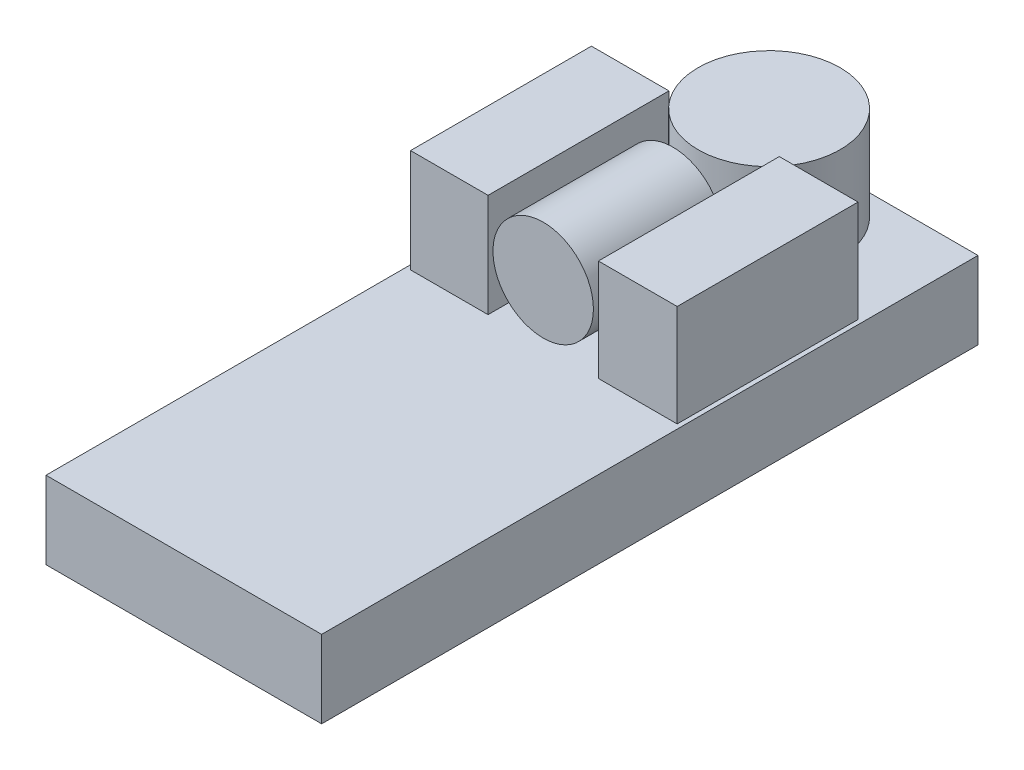
ISO-10303-21;
HEADER;
FILE_DESCRIPTION(('STEP AP214'),'2;1');
FILE_NAME('part.step','',(''),(''),'','','');
FILE_SCHEMA(('AUTOMOTIVE_DESIGN { 1 0 10303 214 1 1 1 1 }'));
ENDSEC;
DATA;
#1=APPLICATION_CONTEXT('core data for automotive mechanical design processes');
#2=APPLICATION_PROTOCOL_DEFINITION('international standard','automotive_design',2000,#1);
#3=PRODUCT_CONTEXT('',#1,'mechanical');
#4=PRODUCT('Part','Part','',(#3));
#5=PRODUCT_RELATED_PRODUCT_CATEGORY('part','',(#4));
#6=PRODUCT_DEFINITION_FORMATION('','',#4);
#7=PRODUCT_DEFINITION_CONTEXT('part definition',#1,'design');
#8=PRODUCT_DEFINITION('design','',#6,#7);
#9=PRODUCT_DEFINITION_SHAPE('','',#8);
#10=(LENGTH_UNIT() NAMED_UNIT(*) SI_UNIT(.MILLI.,.METRE.));
#11=(NAMED_UNIT(*) PLANE_ANGLE_UNIT() SI_UNIT($,.RADIAN.));
#12=(NAMED_UNIT(*) SI_UNIT($,.STERADIAN.) SOLID_ANGLE_UNIT());
#13=UNCERTAINTY_MEASURE_WITH_UNIT(LENGTH_MEASURE(1.E-05),#10,'distance_accuracy_value','');
#14=(GEOMETRIC_REPRESENTATION_CONTEXT(3) GLOBAL_UNCERTAINTY_ASSIGNED_CONTEXT((#13)) GLOBAL_UNIT_ASSIGNED_CONTEXT((#10,
#11,#12)) REPRESENTATION_CONTEXT('',''));
#15=CARTESIAN_POINT('',(0.,0.,0.));
#16=DIRECTION('',(0.,0.,1.));
#17=DIRECTION('',(1.,0.,0.));
#18=AXIS2_PLACEMENT_3D('',#15,#16,#17);
#19=CARTESIAN_POINT('',(10.6202290697626,10.4579145194066,-37.9101323642733));
#20=DIRECTION('',(0.,0.,1.));
#21=DIRECTION('',(1.,0.,0.));
#22=AXIS2_PLACEMENT_3D('',#19,#20,#21);
#23=CYLINDRICAL_SURFACE('',#22,3.8868404645543);
#24=CARTESIAN_POINT('',(10.6202290697626,10.4579145194066,-37.9101323642733));
#25=DIRECTION('',(0.,0.,1.));
#26=DIRECTION('',(1.,0.,0.));
#27=AXIS2_PLACEMENT_3D('',#24,#25,#26);
#28=CIRCLE('',#27,3.8868404645543);
#29=CARTESIAN_POINT('',(14.5070695343169,10.4579145194066,-37.9101323642733));
#30=VERTEX_POINT('',#29);
#31=EDGE_CURVE('E11',#30,#30,#28,.T.);
#32=ORIENTED_EDGE('',*,*,#31,.T.);
#33=EDGE_LOOP('',(#32));
#34=FACE_BOUND('',#33,.T.);
#35=CARTESIAN_POINT('',(10.6202290697626,10.4579145194066,-27.8621323642733));
#36=DIRECTION('',(0.,0.,1.));
#37=DIRECTION('',(1.,0.,0.));
#38=AXIS2_PLACEMENT_3D('',#35,#36,#37);
#39=CIRCLE('',#38,3.8868404645543);
#40=CARTESIAN_POINT('',(14.5070695343169,10.4579145194066,-27.8621323642733));
#41=VERTEX_POINT('',#40);
#42=EDGE_CURVE('E52',#41,#41,#39,.T.);
#43=ORIENTED_EDGE('',*,*,#42,.F.);
#44=EDGE_LOOP('',(#43));
#45=FACE_BOUND('',#44,.T.);
#46=ADVANCED_FACE('F49',(#34,#45),#23,.T.);
#47=CARTESIAN_POINT('',(0.,0.,-37.9101323642733));
#48=DIRECTION('',(0.,0.,1.));
#49=DIRECTION('',(1.,0.,0.));
#50=AXIS2_PLACEMENT_3D('',#47,#48,#49);
#51=PLANE('',#50);
#52=ORIENTED_EDGE('',*,*,#31,.F.);
#53=EDGE_LOOP('',(#52));
#54=FACE_BOUND('',#53,.T.);
#55=ADVANCED_FACE('F64',(#54),#51,.F.);
#56=CARTESIAN_POINT('',(0.,0.,-27.8621323642733));
#57=DIRECTION('',(0.,0.,1.));
#58=DIRECTION('',(1.,0.,0.));
#59=AXIS2_PLACEMENT_3D('',#56,#57,#58);
#60=PLANE('',#59);
#61=ORIENTED_EDGE('',*,*,#42,.T.);
#62=EDGE_LOOP('',(#61));
#63=FACE_BOUND('',#62,.T.);
#64=ADVANCED_FACE('F61',(#63),#60,.T.);
#65=CLOSED_SHELL('',(#46,#55,#64));
#66=MANIFOLD_SOLID_BREP('B2',#65);
#67=CARTESIAN_POINT('',(0.,5.999988,0.));
#68=DIRECTION('',(0.,-1.,0.));
#69=DIRECTION('',(0.,0.,-1.));
#70=AXIS2_PLACEMENT_3D('',#67,#68,#69);
#71=PLANE('',#70);
#72=DIRECTION('',(0.,0.,1.));
#73=VECTOR('',#72,1.);
#74=CARTESIAN_POINT('',(0.346542180294819,5.999988,-41.8688530192899));
#75=LINE('',#74,#73);
#76=CARTESIAN_POINT('',(0.346542180294819,5.999988,-41.8688530192899));
#77=VERTEX_POINT('',#76);
#78=CARTESIAN_POINT('',(0.346542180294819,5.999988,-27.8688530192899));
#79=VERTEX_POINT('',#78);
#80=EDGE_CURVE('E271',#77,#79,#75,.T.);
#81=ORIENTED_EDGE('',*,*,#80,.F.);
#82=DIRECTION('',(-1.,0.,0.));
#83=VECTOR('',#82,1.);
#84=CARTESIAN_POINT('',(0.346542180294819,5.999988,-41.8688530192899));
#85=LINE('',#84,#83);
#86=CARTESIAN_POINT('',(6.34654218029482,5.999988,-41.8688530192899));
#87=VERTEX_POINT('',#86);
#88=EDGE_CURVE('E277',#87,#77,#85,.T.);
#89=ORIENTED_EDGE('',*,*,#88,.F.);
#90=DIRECTION('',(0.,0.,-1.));
#91=VECTOR('',#90,1.);
#92=CARTESIAN_POINT('',(6.34654218029482,5.999988,-41.8688530192899));
#93=LINE('',#92,#91);
#94=CARTESIAN_POINT('',(6.34654218029482,5.999988,-27.8688530192899));
#95=VERTEX_POINT('',#94);
#96=EDGE_CURVE('E294',#95,#87,#93,.T.);
#97=ORIENTED_EDGE('',*,*,#96,.F.);
#98=DIRECTION('',(1.,0.,0.));
#99=VECTOR('',#98,1.);
#100=CARTESIAN_POINT('',(0.346542180294819,5.999988,-27.8688530192899));
#101=LINE('',#100,#99);
#102=EDGE_CURVE('E290',#79,#95,#101,.T.);
#103=ORIENTED_EDGE('',*,*,#102,.F.);
#104=EDGE_LOOP('',(#81,#89,#97,#103));
#105=FACE_BOUND('',#104,.T.);
#106=DIRECTION('',(0.,0.,1.));
#107=VECTOR('',#106,1.);
#108=CARTESIAN_POINT('',(14.8939159592304,5.999988,-27.8621323642733));
#109=LINE('',#108,#107);
#110=CARTESIAN_POINT('',(14.8939159592304,5.999988,-41.7798330207602));
#111=VERTEX_POINT('',#110);
#112=CARTESIAN_POINT('',(14.8939159592304,5.999988,-27.8621323642733));
#113=VERTEX_POINT('',#112);
#114=EDGE_CURVE('E237',#111,#113,#109,.T.);
#115=ORIENTED_EDGE('',*,*,#114,.F.);
#116=CARTESIAN_POINT('',(10.668,5.999988,-45.300011));
#117=DIRECTION('',(0.,1.,0.));
#118=DIRECTION('',(0.,0.,1.));
#119=AXIS2_PLACEMENT_3D('',#116,#117,#118);
#120=CIRCLE('',#119,5.5000017);
#121=CARTESIAN_POINT('',(10.656180529545,5.999988,-50.8));
#122=VERTEX_POINT('',#121);
#123=EDGE_CURVE('E255',#122,#111,#120,.T.);
#124=ORIENTED_EDGE('',*,*,#123,.F.);
#125=DIRECTION('',(-1.,0.,0.));
#126=VECTOR('',#125,1.);
#127=CARTESIAN_POINT('',(0.,5.999988,-50.8));
#128=LINE('',#127,#126);
#129=CARTESIAN_POINT('',(0.,5.999988,-50.8));
#130=VERTEX_POINT('',#129);
#131=EDGE_CURVE('E328',#122,#130,#128,.T.);
#132=ORIENTED_EDGE('',*,*,#131,.T.);
#133=DIRECTION('',(0.,0.,1.));
#134=VECTOR('',#133,1.);
#135=CARTESIAN_POINT('',(0.,5.999988,0.));
#136=LINE('',#135,#134);
#137=CARTESIAN_POINT('',(0.,5.999988,0.));
#138=VERTEX_POINT('',#137);
#139=EDGE_CURVE('E317',#130,#138,#136,.T.);
#140=ORIENTED_EDGE('',*,*,#139,.T.);
#141=DIRECTION('',(1.,0.,0.));
#142=VECTOR('',#141,1.);
#143=CARTESIAN_POINT('',(0.,5.999988,0.));
#144=LINE('',#143,#142);
#145=CARTESIAN_POINT('',(21.336,5.999988,0.));
#146=VERTEX_POINT('',#145);
#147=EDGE_CURVE('E321',#138,#146,#144,.T.);
#148=ORIENTED_EDGE('',*,*,#147,.T.);
#149=DIRECTION('',(0.,0.,-1.));
#150=VECTOR('',#149,1.);
#151=CARTESIAN_POINT('',(21.336,5.999988,0.));
#152=LINE('',#151,#150);
#153=CARTESIAN_POINT('',(21.336,5.999988,-50.8));
#154=VERTEX_POINT('',#153);
#155=EDGE_CURVE('E325',#146,#154,#152,.T.);
#156=ORIENTED_EDGE('',*,*,#155,.T.);
#157=CARTESIAN_POINT('',(10.679819470455,5.999988,-50.8));
#158=VERTEX_POINT('',#157);
#159=EDGE_CURVE('E329',#154,#158,#128,.T.);
#160=ORIENTED_EDGE('',*,*,#159,.T.);
#161=CARTESIAN_POINT('',(14.9611351231957,5.999988,-41.8621323642733));
#162=VERTEX_POINT('',#161);
#163=EDGE_CURVE('E119',#162,#158,#120,.T.);
#164=ORIENTED_EDGE('',*,*,#163,.F.);
#165=DIRECTION('',(-1.,0.,0.));
#166=VECTOR('',#165,1.);
#167=CARTESIAN_POINT('',(14.8939159592304,5.999988,-41.8621323642733));
#168=LINE('',#167,#166);
#169=CARTESIAN_POINT('',(20.9899159592304,5.999988,-41.8621323642733));
#170=VERTEX_POINT('',#169);
#171=EDGE_CURVE('E233',#170,#162,#168,.T.);
#172=ORIENTED_EDGE('',*,*,#171,.F.);
#173=DIRECTION('',(0.,0.,-1.));
#174=VECTOR('',#173,1.);
#175=CARTESIAN_POINT('',(20.9899159592304,5.999988,-27.8621323642733));
#176=LINE('',#175,#174);
#177=CARTESIAN_POINT('',(20.9899159592304,5.999988,-27.8621323642733));
#178=VERTEX_POINT('',#177);
#179=EDGE_CURVE('E395',#178,#170,#176,.T.);
#180=ORIENTED_EDGE('',*,*,#179,.F.);
#181=DIRECTION('',(1.,0.,0.));
#182=VECTOR('',#181,1.);
#183=CARTESIAN_POINT('',(14.8939159592304,5.999988,-27.8621323642733));
#184=LINE('',#183,#182);
#185=EDGE_CURVE('E391',#113,#178,#184,.T.);
#186=ORIENTED_EDGE('',*,*,#185,.F.);
#187=EDGE_LOOP('',(#115,#124,#132,#140,#148,#156,#160,#164,#172,#180,#186));
#188=FACE_BOUND('',#187,.T.);
#189=ADVANCED_FACE('F96',(#105,#188),#71,.F.);
#190=CARTESIAN_POINT('',(10.668,13.253988,-45.300011));
#191=DIRECTION('',(0.,-1.,0.));
#192=DIRECTION('',(0.,0.,-1.));
#193=AXIS2_PLACEMENT_3D('',#190,#191,#192);
#194=CYLINDRICAL_SURFACE('',#193,5.5000017);
#195=DIRECTION('',(0.,-1.,0.));
#196=VECTOR('',#195,1.);
#197=CARTESIAN_POINT('',(14.8939159592304,13.253988,-41.7798330207602));
#198=LINE('',#197,#196);
#199=CARTESIAN_POINT('',(14.8939159592304,13.253988,-41.7798330207602));
#200=VERTEX_POINT('',#199);
#201=EDGE_CURVE('E242',#200,#111,#198,.T.);
#202=ORIENTED_EDGE('',*,*,#201,.F.);
#203=CARTESIAN_POINT('',(10.668,13.253988,-45.300011));
#204=DIRECTION('',(0.,1.,0.));
#205=DIRECTION('',(0.,0.,1.));
#206=AXIS2_PLACEMENT_3D('',#203,#204,#205);
#207=CIRCLE('',#206,5.5000017);
#208=CARTESIAN_POINT('',(10.656180529545,13.253988,-50.8));
#209=VERTEX_POINT('',#208);
#210=EDGE_CURVE('E256',#209,#200,#207,.T.);
#211=ORIENTED_EDGE('',*,*,#210,.F.);
#212=DIRECTION('',(0.,-1.,0.));
#213=VECTOR('',#212,1.);
#214=CARTESIAN_POINT('',(10.656180529545,13.253988,-50.8));
#215=LINE('',#214,#213);
#216=EDGE_CURVE('E267',#209,#122,#215,.T.);
#217=ORIENTED_EDGE('',*,*,#216,.T.);
#218=ORIENTED_EDGE('',*,*,#123,.T.);
#219=EDGE_LOOP('',(#202,#211,#217,#218));
#220=FACE_BOUND('',#219,.T.);
#221=ADVANCED_FACE('F389',(#220),#194,.T.);
#222=DIRECTION('',(0.,-1.,0.));
#223=VECTOR('',#222,1.);
#224=CARTESIAN_POINT('',(14.9611351231957,13.253988,-41.8621323642733));
#225=LINE('',#224,#223);
#226=CARTESIAN_POINT('',(14.9611351231957,13.253988,-41.8621323642733));
#227=VERTEX_POINT('',#226);
#228=EDGE_CURVE('E112',#162,#227,#225,.F.);
#229=ORIENTED_EDGE('',*,*,#228,.F.);
#230=ORIENTED_EDGE('',*,*,#163,.T.);
#231=DIRECTION('',(0.,-1.,0.));
#232=VECTOR('',#231,1.);
#233=CARTESIAN_POINT('',(10.679819470455,13.253988,-50.8));
#234=LINE('',#233,#232);
#235=CARTESIAN_POINT('',(10.679819470455,13.253988,-50.8));
#236=VERTEX_POINT('',#235);
#237=EDGE_CURVE('E260',#236,#158,#234,.T.);
#238=ORIENTED_EDGE('',*,*,#237,.F.);
#239=EDGE_CURVE('E254',#227,#236,#207,.T.);
#240=ORIENTED_EDGE('',*,*,#239,.F.);
#241=EDGE_LOOP('',(#229,#230,#238,#240));
#242=FACE_BOUND('',#241,.T.);
#243=ADVANCED_FACE('F362',(#242),#194,.T.);
#244=CARTESIAN_POINT('',(0.,13.253988,0.));
#245=DIRECTION('',(0.,1.,0.));
#246=DIRECTION('',(0.,0.,1.));
#247=AXIS2_PLACEMENT_3D('',#244,#245,#246);
#248=PLANE('',#247);
#249=ORIENTED_EDGE('',*,*,#210,.T.);
#250=DIRECTION('',(0.,0.,-1.));
#251=VECTOR('',#250,1.);
#252=CARTESIAN_POINT('',(14.8939159592304,13.253988,0.));
#253=LINE('',#252,#251);
#254=CARTESIAN_POINT('',(14.8939159592304,13.253988,-41.8621323642733));
#255=VERTEX_POINT('',#254);
#256=EDGE_CURVE('E47',#200,#255,#253,.T.);
#257=ORIENTED_EDGE('',*,*,#256,.T.);
#258=DIRECTION('',(1.,0.,0.));
#259=VECTOR('',#258,1.);
#260=CARTESIAN_POINT('',(0.,13.253988,-41.8621323642733));
#261=LINE('',#260,#259);
#262=EDGE_CURVE('E105',#255,#227,#261,.T.);
#263=ORIENTED_EDGE('',*,*,#262,.T.);
#264=ORIENTED_EDGE('',*,*,#239,.T.);
#265=DIRECTION('',(-1.,0.,0.));
#266=VECTOR('',#265,1.);
#267=CARTESIAN_POINT('',(0.,13.253988,-50.8));
#268=LINE('',#267,#266);
#269=EDGE_CURVE('E250',#236,#209,#268,.T.);
#270=ORIENTED_EDGE('',*,*,#269,.T.);
#271=EDGE_LOOP('',(#249,#257,#263,#264,#270));
#272=FACE_BOUND('',#271,.T.);
#273=ADVANCED_FACE('F361',(#272),#248,.T.);
#274=CARTESIAN_POINT('',(0.,5.999988,0.));
#275=DIRECTION('',(1.,0.,0.));
#276=DIRECTION('',(0.,0.,-1.));
#277=AXIS2_PLACEMENT_3D('',#274,#275,#276);
#278=PLANE('',#277);
#279=DIRECTION('',(0.,0.,1.));
#280=VECTOR('',#279,1.);
#281=CARTESIAN_POINT('',(0.,0.,0.));
#282=LINE('',#281,#280);
#283=CARTESIAN_POINT('',(0.,0.,-50.8));
#284=VERTEX_POINT('',#283);
#285=CARTESIAN_POINT('',(0.,0.,0.));
#286=VERTEX_POINT('',#285);
#287=EDGE_CURVE('E316',#284,#286,#282,.T.);
#288=ORIENTED_EDGE('',*,*,#287,.T.);
#289=DIRECTION('',(0.,-1.,0.));
#290=VECTOR('',#289,1.);
#291=CARTESIAN_POINT('',(0.,5.999988,0.));
#292=LINE('',#291,#290);
#293=EDGE_CURVE('E355',#138,#286,#292,.T.);
#294=ORIENTED_EDGE('',*,*,#293,.F.);
#295=ORIENTED_EDGE('',*,*,#139,.F.);
#296=DIRECTION('',(0.,-1.,0.));
#297=VECTOR('',#296,1.);
#298=CARTESIAN_POINT('',(0.,5.999988,-50.8));
#299=LINE('',#298,#297);
#300=EDGE_CURVE('E332',#130,#284,#299,.T.);
#301=ORIENTED_EDGE('',*,*,#300,.T.);
#302=EDGE_LOOP('',(#288,#294,#295,#301));
#303=FACE_BOUND('',#302,.T.);
#304=ADVANCED_FACE('F98',(#303),#278,.F.);
#305=CARTESIAN_POINT('',(0.,5.999988,0.));
#306=DIRECTION('',(0.,0.,-1.));
#307=DIRECTION('',(-1.,0.,0.));
#308=AXIS2_PLACEMENT_3D('',#305,#306,#307);
#309=PLANE('',#308);
#310=DIRECTION('',(1.,0.,0.));
#311=VECTOR('',#310,1.);
#312=CARTESIAN_POINT('',(0.,0.,0.));
#313=LINE('',#312,#311);
#314=CARTESIAN_POINT('',(21.336,0.,0.));
#315=VERTEX_POINT('',#314);
#316=EDGE_CURVE('E336',#286,#315,#313,.T.);
#317=ORIENTED_EDGE('',*,*,#316,.T.);
#318=DIRECTION('',(0.,-1.,0.));
#319=VECTOR('',#318,1.);
#320=CARTESIAN_POINT('',(21.336,5.999988,0.));
#321=LINE('',#320,#319);
#322=EDGE_CURVE('E351',#146,#315,#321,.T.);
#323=ORIENTED_EDGE('',*,*,#322,.F.);
#324=ORIENTED_EDGE('',*,*,#147,.F.);
#325=ORIENTED_EDGE('',*,*,#293,.T.);
#326=EDGE_LOOP('',(#317,#323,#324,#325));
#327=FACE_BOUND('',#326,.T.);
#328=ADVANCED_FACE('F379',(#327),#309,.F.);
#329=CARTESIAN_POINT('',(21.336,5.999988,0.));
#330=DIRECTION('',(-1.,0.,0.));
#331=DIRECTION('',(0.,0.,1.));
#332=AXIS2_PLACEMENT_3D('',#329,#330,#331);
#333=PLANE('',#332);
#334=DIRECTION('',(0.,0.,-1.));
#335=VECTOR('',#334,1.);
#336=CARTESIAN_POINT('',(21.336,0.,0.));
#337=LINE('',#336,#335);
#338=CARTESIAN_POINT('',(21.336,0.,-50.8));
#339=VERTEX_POINT('',#338);
#340=EDGE_CURVE('E339',#315,#339,#337,.T.);
#341=ORIENTED_EDGE('',*,*,#340,.T.);
#342=DIRECTION('',(0.,-1.,0.));
#343=VECTOR('',#342,1.);
#344=CARTESIAN_POINT('',(21.336,5.999988,-50.8));
#345=LINE('',#344,#343);
#346=EDGE_CURVE('E347',#154,#339,#345,.T.);
#347=ORIENTED_EDGE('',*,*,#346,.F.);
#348=ORIENTED_EDGE('',*,*,#155,.F.);
#349=ORIENTED_EDGE('',*,*,#322,.T.);
#350=EDGE_LOOP('',(#341,#347,#348,#349));
#351=FACE_BOUND('',#350,.T.);
#352=ADVANCED_FACE('F385',(#351),#333,.F.);
#353=CARTESIAN_POINT('',(0.,5.999988,-50.8));
#354=DIRECTION('',(0.,0.,1.));
#355=DIRECTION('',(1.,0.,0.));
#356=AXIS2_PLACEMENT_3D('',#353,#354,#355);
#357=PLANE('',#356);
#358=DIRECTION('',(-1.,0.,0.));
#359=VECTOR('',#358,1.);
#360=CARTESIAN_POINT('',(0.,0.,-50.8));
#361=LINE('',#360,#359);
#362=EDGE_CURVE('E322',#339,#284,#361,.T.);
#363=ORIENTED_EDGE('',*,*,#362,.T.);
#364=ORIENTED_EDGE('',*,*,#300,.F.);
#365=ORIENTED_EDGE('',*,*,#131,.F.);
#366=ORIENTED_EDGE('',*,*,#216,.F.);
#367=ORIENTED_EDGE('',*,*,#269,.F.);
#368=ORIENTED_EDGE('',*,*,#237,.T.);
#369=ORIENTED_EDGE('',*,*,#159,.F.);
#370=ORIENTED_EDGE('',*,*,#346,.T.);
#371=EDGE_LOOP('',(#363,#364,#365,#366,#367,#368,#369,#370));
#372=FACE_BOUND('',#371,.T.);
#373=ADVANCED_FACE('F374',(#372),#357,.F.);
#374=CARTESIAN_POINT('',(0.,0.,0.));
#375=DIRECTION('',(0.,-1.,0.));
#376=DIRECTION('',(0.,0.,-1.));
#377=AXIS2_PLACEMENT_3D('',#374,#375,#376);
#378=PLANE('',#377);
#379=ORIENTED_EDGE('',*,*,#287,.F.);
#380=ORIENTED_EDGE('',*,*,#362,.F.);
#381=ORIENTED_EDGE('',*,*,#340,.F.);
#382=ORIENTED_EDGE('',*,*,#316,.F.);
#383=EDGE_LOOP('',(#379,#380,#381,#382));
#384=FACE_BOUND('',#383,.T.);
#385=ADVANCED_FACE('F435',(#384),#378,.T.);
#386=CARTESIAN_POINT('',(0.346542180294819,13.999988,-41.8688530192899));
#387=DIRECTION('',(1.,0.,0.));
#388=DIRECTION('',(0.,0.,-1.));
#389=AXIS2_PLACEMENT_3D('',#386,#387,#388);
#390=PLANE('',#389);
#391=ORIENTED_EDGE('',*,*,#80,.T.);
#392=DIRECTION('',(0.,-1.,0.));
#393=VECTOR('',#392,1.);
#394=CARTESIAN_POINT('',(0.346542180294819,13.999988,-27.8688530192899));
#395=LINE('',#394,#393);
#396=CARTESIAN_POINT('',(0.346542180294819,13.999988,-27.8688530192899));
#397=VERTEX_POINT('',#396);
#398=EDGE_CURVE('E312',#397,#79,#395,.T.);
#399=ORIENTED_EDGE('',*,*,#398,.F.);
#400=DIRECTION('',(0.,0.,1.));
#401=VECTOR('',#400,1.);
#402=CARTESIAN_POINT('',(0.346542180294819,13.999988,-41.8688530192899));
#403=LINE('',#402,#401);
#404=CARTESIAN_POINT('',(0.346542180294819,13.999988,-41.8688530192899));
#405=VERTEX_POINT('',#404);
#406=EDGE_CURVE('E272',#405,#397,#403,.T.);
#407=ORIENTED_EDGE('',*,*,#406,.F.);
#408=DIRECTION('',(0.,-1.,0.));
#409=VECTOR('',#408,1.);
#410=CARTESIAN_POINT('',(0.346542180294819,13.999988,-41.8688530192899));
#411=LINE('',#410,#409);
#412=EDGE_CURVE('E286',#405,#77,#411,.T.);
#413=ORIENTED_EDGE('',*,*,#412,.T.);
#414=EDGE_LOOP('',(#391,#399,#407,#413));
#415=FACE_BOUND('',#414,.T.);
#416=ADVANCED_FACE('F433',(#415),#390,.F.);
#417=CARTESIAN_POINT('',(0.346542180294819,13.999988,-27.8688530192899));
#418=DIRECTION('',(0.,0.,-1.));
#419=DIRECTION('',(-1.,0.,0.));
#420=AXIS2_PLACEMENT_3D('',#417,#418,#419);
#421=PLANE('',#420);
#422=ORIENTED_EDGE('',*,*,#102,.T.);
#423=DIRECTION('',(0.,-1.,0.));
#424=VECTOR('',#423,1.);
#425=CARTESIAN_POINT('',(6.34654218029482,13.999988,-27.8688530192899));
#426=LINE('',#425,#424);
#427=CARTESIAN_POINT('',(6.34654218029482,13.999988,-27.8688530192899));
#428=VERTEX_POINT('',#427);
#429=EDGE_CURVE('E308',#428,#95,#426,.T.);
#430=ORIENTED_EDGE('',*,*,#429,.F.);
#431=DIRECTION('',(1.,0.,0.));
#432=VECTOR('',#431,1.);
#433=CARTESIAN_POINT('',(0.346542180294819,13.999988,-27.8688530192899));
#434=LINE('',#433,#432);
#435=EDGE_CURVE('E276',#397,#428,#434,.T.);
#436=ORIENTED_EDGE('',*,*,#435,.F.);
#437=ORIENTED_EDGE('',*,*,#398,.T.);
#438=EDGE_LOOP('',(#422,#430,#436,#437));
#439=FACE_BOUND('',#438,.T.);
#440=ADVANCED_FACE('F465',(#439),#421,.F.);
#441=CARTESIAN_POINT('',(6.34654218029482,13.999988,-41.8688530192899));
#442=DIRECTION('',(-1.,0.,0.));
#443=DIRECTION('',(0.,0.,1.));
#444=AXIS2_PLACEMENT_3D('',#441,#442,#443);
#445=PLANE('',#444);
#446=ORIENTED_EDGE('',*,*,#96,.T.);
#447=DIRECTION('',(0.,-1.,0.));
#448=VECTOR('',#447,1.);
#449=CARTESIAN_POINT('',(6.34654218029482,13.999988,-41.8688530192899));
#450=LINE('',#449,#448);
#451=CARTESIAN_POINT('',(6.34654218029482,13.999988,-41.8688530192899));
#452=VERTEX_POINT('',#451);
#453=EDGE_CURVE('E304',#452,#87,#450,.T.);
#454=ORIENTED_EDGE('',*,*,#453,.F.);
#455=DIRECTION('',(0.,0.,-1.));
#456=VECTOR('',#455,1.);
#457=CARTESIAN_POINT('',(6.34654218029482,13.999988,-41.8688530192899));
#458=LINE('',#457,#456);
#459=EDGE_CURVE('E280',#428,#452,#458,.T.);
#460=ORIENTED_EDGE('',*,*,#459,.F.);
#461=ORIENTED_EDGE('',*,*,#429,.T.);
#462=EDGE_LOOP('',(#446,#454,#460,#461));
#463=FACE_BOUND('',#462,.T.);
#464=ADVANCED_FACE('F462',(#463),#445,.F.);
#465=CARTESIAN_POINT('',(0.346542180294819,13.999988,-41.8688530192899));
#466=DIRECTION('',(0.,0.,1.));
#467=DIRECTION('',(1.,0.,0.));
#468=AXIS2_PLACEMENT_3D('',#465,#466,#467);
#469=PLANE('',#468);
#470=ORIENTED_EDGE('',*,*,#88,.T.);
#471=ORIENTED_EDGE('',*,*,#412,.F.);
#472=DIRECTION('',(-1.,0.,0.));
#473=VECTOR('',#472,1.);
#474=CARTESIAN_POINT('',(0.346542180294819,13.999988,-41.8688530192899));
#475=LINE('',#474,#473);
#476=EDGE_CURVE('E283',#452,#405,#475,.T.);
#477=ORIENTED_EDGE('',*,*,#476,.F.);
#478=ORIENTED_EDGE('',*,*,#453,.T.);
#479=EDGE_LOOP('',(#470,#471,#477,#478));
#480=FACE_BOUND('',#479,.T.);
#481=ADVANCED_FACE('F458',(#480),#469,.F.);
#482=CARTESIAN_POINT('',(0.,13.999988,0.));
#483=DIRECTION('',(0.,1.,0.));
#484=DIRECTION('',(0.,0.,1.));
#485=AXIS2_PLACEMENT_3D('',#482,#483,#484);
#486=PLANE('',#485);
#487=ORIENTED_EDGE('',*,*,#406,.T.);
#488=ORIENTED_EDGE('',*,*,#435,.T.);
#489=ORIENTED_EDGE('',*,*,#459,.T.);
#490=ORIENTED_EDGE('',*,*,#476,.T.);
#491=EDGE_LOOP('',(#487,#488,#489,#490));
#492=FACE_BOUND('',#491,.T.);
#493=ADVANCED_FACE('F455',(#492),#486,.T.);
#494=CARTESIAN_POINT('',(14.8939159592304,13.873988,-27.8621323642733));
#495=DIRECTION('',(1.,0.,0.));
#496=DIRECTION('',(0.,0.,-1.));
#497=AXIS2_PLACEMENT_3D('',#494,#495,#496);
#498=PLANE('',#497);
#499=ORIENTED_EDGE('',*,*,#256,.F.);
#500=ORIENTED_EDGE('',*,*,#201,.T.);
#501=ORIENTED_EDGE('',*,*,#114,.T.);
#502=DIRECTION('',(0.,-1.,0.));
#503=VECTOR('',#502,1.);
#504=CARTESIAN_POINT('',(14.8939159592304,13.873988,-27.8621323642733));
#505=LINE('',#504,#503);
#506=CARTESIAN_POINT('',(14.8939159592304,13.873988,-27.8621323642733));
#507=VERTEX_POINT('',#506);
#508=EDGE_CURVE('E215',#507,#113,#505,.T.);
#509=ORIENTED_EDGE('',*,*,#508,.F.);
#510=DIRECTION('',(0.,0.,1.));
#511=VECTOR('',#510,1.);
#512=CARTESIAN_POINT('',(14.8939159592304,13.873988,-27.8621323642733));
#513=LINE('',#512,#511);
#514=CARTESIAN_POINT('',(14.8939159592304,13.873988,-41.8621323642733));
#515=VERTEX_POINT('',#514);
#516=EDGE_CURVE('E223',#515,#507,#513,.T.);
#517=ORIENTED_EDGE('',*,*,#516,.F.);
#518=DIRECTION('',(0.,-1.,0.));
#519=VECTOR('',#518,1.);
#520=CARTESIAN_POINT('',(14.8939159592304,13.873988,-41.8621323642733));
#521=LINE('',#520,#519);
#522=EDGE_CURVE('E404',#515,#255,#521,.T.);
#523=ORIENTED_EDGE('',*,*,#522,.T.);
#524=EDGE_LOOP('',(#499,#500,#501,#509,#517,#523));
#525=FACE_BOUND('',#524,.T.);
#526=ADVANCED_FACE('F235',(#525),#498,.F.);
#527=CARTESIAN_POINT('',(14.8939159592304,13.873988,-41.8621323642733));
#528=DIRECTION('',(0.,0.,1.));
#529=DIRECTION('',(1.,0.,0.));
#530=AXIS2_PLACEMENT_3D('',#527,#528,#529);
#531=PLANE('',#530);
#532=ORIENTED_EDGE('',*,*,#171,.T.);
#533=ORIENTED_EDGE('',*,*,#228,.T.);
#534=ORIENTED_EDGE('',*,*,#262,.F.);
#535=ORIENTED_EDGE('',*,*,#522,.F.);
#536=DIRECTION('',(-1.,0.,0.));
#537=VECTOR('',#536,1.);
#538=CARTESIAN_POINT('',(14.8939159592304,13.873988,-41.8621323642733));
#539=LINE('',#538,#537);
#540=CARTESIAN_POINT('',(20.9899159592304,13.873988,-41.8621323642733));
#541=VERTEX_POINT('',#540);
#542=EDGE_CURVE('E228',#541,#515,#539,.T.);
#543=ORIENTED_EDGE('',*,*,#542,.F.);
#544=DIRECTION('',(0.,-1.,0.));
#545=VECTOR('',#544,1.);
#546=CARTESIAN_POINT('',(20.9899159592304,13.873988,-41.8621323642733));
#547=LINE('',#546,#545);
#548=EDGE_CURVE('E244',#541,#170,#547,.T.);
#549=ORIENTED_EDGE('',*,*,#548,.T.);
#550=EDGE_LOOP('',(#532,#533,#534,#535,#543,#549));
#551=FACE_BOUND('',#550,.T.);
#552=ADVANCED_FACE('F410',(#551),#531,.F.);
#553=CARTESIAN_POINT('',(14.8939159592304,13.873988,-27.8621323642733));
#554=DIRECTION('',(0.,0.,-1.));
#555=DIRECTION('',(-1.,0.,0.));
#556=AXIS2_PLACEMENT_3D('',#553,#554,#555);
#557=PLANE('',#556);
#558=ORIENTED_EDGE('',*,*,#185,.T.);
#559=DIRECTION('',(0.,-1.,0.));
#560=VECTOR('',#559,1.);
#561=CARTESIAN_POINT('',(20.9899159592304,13.873988,-27.8621323642733));
#562=LINE('',#561,#560);
#563=CARTESIAN_POINT('',(20.9899159592304,13.873988,-27.8621323642733));
#564=VERTEX_POINT('',#563);
#565=EDGE_CURVE('E218',#564,#178,#562,.T.);
#566=ORIENTED_EDGE('',*,*,#565,.F.);
#567=DIRECTION('',(1.,0.,0.));
#568=VECTOR('',#567,1.);
#569=CARTESIAN_POINT('',(14.8939159592304,13.873988,-27.8621323642733));
#570=LINE('',#569,#568);
#571=EDGE_CURVE('E211',#507,#564,#570,.T.);
#572=ORIENTED_EDGE('',*,*,#571,.F.);
#573=ORIENTED_EDGE('',*,*,#508,.T.);
#574=EDGE_LOOP('',(#558,#566,#572,#573));
#575=FACE_BOUND('',#574,.T.);
#576=ADVANCED_FACE('F213',(#575),#557,.F.);
#577=CARTESIAN_POINT('',(20.9899159592304,13.873988,-27.8621323642733));
#578=DIRECTION('',(-1.,0.,0.));
#579=DIRECTION('',(0.,0.,1.));
#580=AXIS2_PLACEMENT_3D('',#577,#578,#579);
#581=PLANE('',#580);
#582=ORIENTED_EDGE('',*,*,#179,.T.);
#583=ORIENTED_EDGE('',*,*,#548,.F.);
#584=DIRECTION('',(0.,0.,-1.));
#585=VECTOR('',#584,1.);
#586=CARTESIAN_POINT('',(20.9899159592304,13.873988,-27.8621323642733));
#587=LINE('',#586,#585);
#588=EDGE_CURVE('E222',#564,#541,#587,.T.);
#589=ORIENTED_EDGE('',*,*,#588,.F.);
#590=ORIENTED_EDGE('',*,*,#565,.T.);
#591=EDGE_LOOP('',(#582,#583,#589,#590));
#592=FACE_BOUND('',#591,.T.);
#593=ADVANCED_FACE('F412',(#592),#581,.F.);
#594=CARTESIAN_POINT('',(0.,13.873988,0.));
#595=DIRECTION('',(0.,-1.,0.));
#596=DIRECTION('',(0.,0.,-1.));
#597=AXIS2_PLACEMENT_3D('',#594,#595,#596);
#598=PLANE('',#597);
#599=ORIENTED_EDGE('',*,*,#516,.T.);
#600=ORIENTED_EDGE('',*,*,#571,.T.);
#601=ORIENTED_EDGE('',*,*,#588,.T.);
#602=ORIENTED_EDGE('',*,*,#542,.T.);
#603=EDGE_LOOP('',(#599,#600,#601,#602));
#604=FACE_BOUND('',#603,.T.);
#605=ADVANCED_FACE('F226',(#604),#598,.F.);
#606=CLOSED_SHELL('',(#189,#221,#243,#273,#304,#328,#352,#373,#385,#416,#440,#464,#481,#493,
#526,#552,#576,#593,#605));
#607=MANIFOLD_SOLID_BREP('B6',#606);
#608=ADVANCED_BREP_SHAPE_REPRESENTATION('',(#18,#66,#607),#14);
#609=SHAPE_DEFINITION_REPRESENTATION(#9,#608);
ENDSEC;
END-ISO-10303-21;
